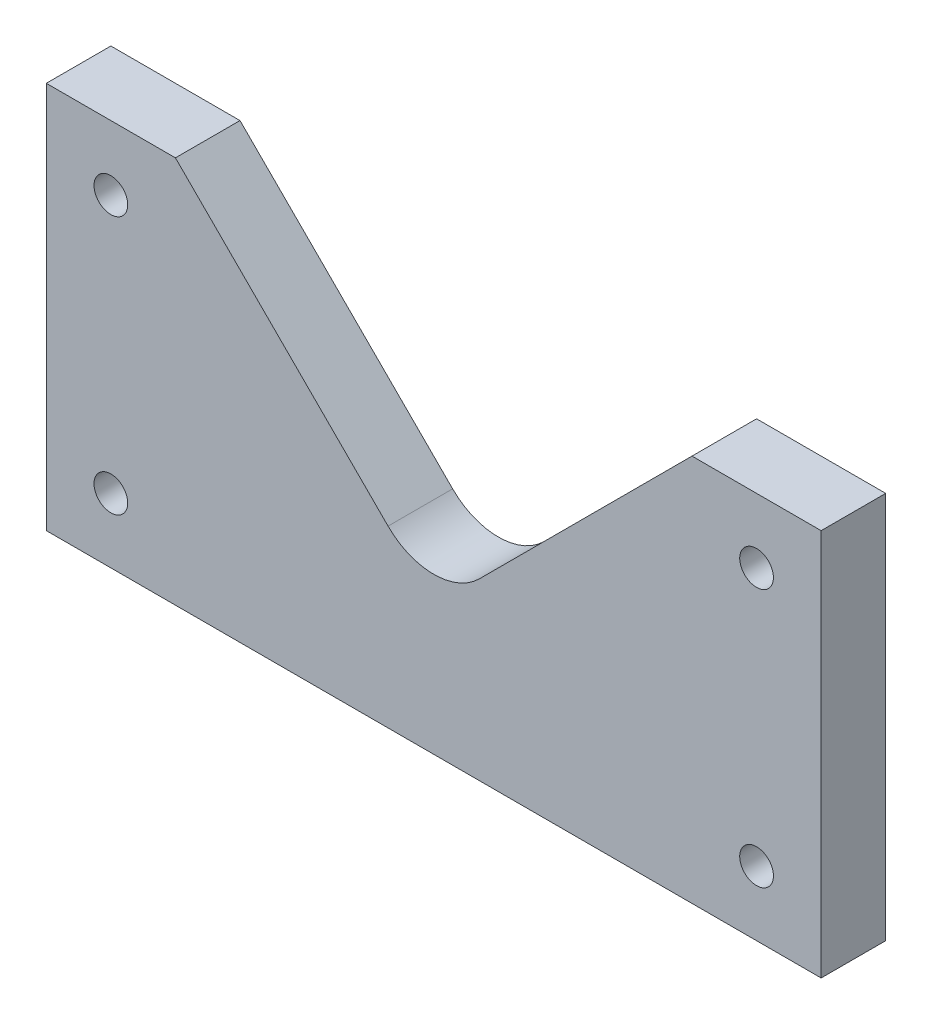
ISO-10303-21;
HEADER;
FILE_DESCRIPTION(('STEP AP214'),'2;1');
FILE_NAME('part.step','',(''),(''),'','','');
FILE_SCHEMA(('AUTOMOTIVE_DESIGN { 1 0 10303 214 1 1 1 1 }'));
ENDSEC;
DATA;
#1=APPLICATION_CONTEXT('core data for automotive mechanical design processes');
#2=APPLICATION_PROTOCOL_DEFINITION('international standard','automotive_design',2000,#1);
#3=PRODUCT_CONTEXT('',#1,'mechanical');
#4=PRODUCT('Part','Part','',(#3));
#5=PRODUCT_RELATED_PRODUCT_CATEGORY('part','',(#4));
#6=PRODUCT_DEFINITION_FORMATION('','',#4);
#7=PRODUCT_DEFINITION_CONTEXT('part definition',#1,'design');
#8=PRODUCT_DEFINITION('design','',#6,#7);
#9=PRODUCT_DEFINITION_SHAPE('','',#8);
#10=(LENGTH_UNIT() NAMED_UNIT(*) SI_UNIT(.MILLI.,.METRE.));
#11=(NAMED_UNIT(*) PLANE_ANGLE_UNIT() SI_UNIT($,.RADIAN.));
#12=(NAMED_UNIT(*) SI_UNIT($,.STERADIAN.) SOLID_ANGLE_UNIT());
#13=UNCERTAINTY_MEASURE_WITH_UNIT(LENGTH_MEASURE(1.E-05),#10,'distance_accuracy_value','');
#14=(GEOMETRIC_REPRESENTATION_CONTEXT(3) GLOBAL_UNCERTAINTY_ASSIGNED_CONTEXT((#13)) GLOBAL_UNIT_ASSIGNED_CONTEXT((#10,
#11,#12)) REPRESENTATION_CONTEXT('',''));
#15=CARTESIAN_POINT('',(0.,0.,0.));
#16=DIRECTION('',(0.,0.,1.));
#17=DIRECTION('',(1.,0.,0.));
#18=AXIS2_PLACEMENT_3D('',#15,#16,#17);
#19=CARTESIAN_POINT('',(0.,17.9605122421383,-6.35));
#20=DIRECTION('',(0.,0.,-1.));
#21=DIRECTION('',(-1.,0.,0.));
#22=AXIS2_PLACEMENT_3D('',#19,#20,#21);
#23=CYLINDRICAL_SURFACE('',#22,12.7);
#24=DIRECTION('',(0.,0.,1.));
#25=VECTOR('',#24,1.);
#26=CARTESIAN_POINT('',(8.98025612106917,8.9802561210692,-6.35));
#27=LINE('',#26,#25);
#28=CARTESIAN_POINT('',(8.98025612106917,8.9802561210692,-6.35));
#29=VERTEX_POINT('',#28);
#30=CARTESIAN_POINT('',(8.98025612106917,8.9802561210692,6.35));
#31=VERTEX_POINT('',#30);
#32=EDGE_CURVE('E137',#29,#31,#27,.T.);
#33=ORIENTED_EDGE('',*,*,#32,.F.);
#34=CARTESIAN_POINT('',(0.,17.9605122421383,-6.35));
#35=DIRECTION('',(0.,0.,1.));
#36=DIRECTION('',(1.,0.,0.));
#37=AXIS2_PLACEMENT_3D('',#34,#35,#36);
#38=CIRCLE('',#37,12.7);
#39=CARTESIAN_POINT('',(-8.98025612106917,8.9802561210692,-6.35));
#40=VERTEX_POINT('',#39);
#41=EDGE_CURVE('E40',#29,#40,#38,.F.);
#42=ORIENTED_EDGE('',*,*,#41,.T.);
#43=DIRECTION('',(0.,0.,1.));
#44=VECTOR('',#43,1.);
#45=CARTESIAN_POINT('',(-8.98025612106917,8.9802561210692,-6.35));
#46=LINE('',#45,#44);
#47=CARTESIAN_POINT('',(-8.98025612106917,8.9802561210692,6.35));
#48=VERTEX_POINT('',#47);
#49=EDGE_CURVE('E140',#48,#40,#46,.F.);
#50=ORIENTED_EDGE('',*,*,#49,.F.);
#51=CARTESIAN_POINT('',(0.,17.9605122421383,6.35));
#52=DIRECTION('',(0.,0.,1.));
#53=DIRECTION('',(1.,0.,0.));
#54=AXIS2_PLACEMENT_3D('',#51,#52,#53);
#55=CIRCLE('',#54,12.7);
#56=EDGE_CURVE('E11',#48,#31,#55,.T.);
#57=ORIENTED_EDGE('',*,*,#56,.T.);
#58=EDGE_LOOP('',(#33,#42,#50,#57));
#59=FACE_BOUND('',#58,.T.);
#60=ADVANCED_FACE('F33',(#59),#23,.F.);
#61=CARTESIAN_POINT('',(-76.2,50.8,6.35));
#62=DIRECTION('',(0.,-1.,0.));
#63=DIRECTION('',(0.,0.,-1.));
#64=AXIS2_PLACEMENT_3D('',#61,#62,#63);
#65=PLANE('',#64);
#66=DIRECTION('',(-1.,0.,0.));
#67=VECTOR('',#66,1.);
#68=CARTESIAN_POINT('',(-76.2,50.8,6.35));
#69=LINE('',#68,#67);
#70=CARTESIAN_POINT('',(-50.7999999999998,50.8,6.35));
#71=VERTEX_POINT('',#70);
#72=CARTESIAN_POINT('',(-76.2,50.8,6.35));
#73=VERTEX_POINT('',#72);
#74=EDGE_CURVE('E159',#71,#73,#69,.T.);
#75=ORIENTED_EDGE('',*,*,#74,.F.);
#76=DIRECTION('',(0.,0.,1.));
#77=VECTOR('',#76,1.);
#78=CARTESIAN_POINT('',(-50.7999999999998,50.8,-6.35));
#79=LINE('',#78,#77);
#80=CARTESIAN_POINT('',(-50.7999999999998,50.8,-6.35));
#81=VERTEX_POINT('',#80);
#82=EDGE_CURVE('E121',#81,#71,#79,.T.);
#83=ORIENTED_EDGE('',*,*,#82,.F.);
#84=DIRECTION('',(-1.,0.,0.));
#85=VECTOR('',#84,1.);
#86=CARTESIAN_POINT('',(-76.2,50.8,-6.35));
#87=LINE('',#86,#85);
#88=CARTESIAN_POINT('',(-76.2,50.8,-6.35));
#89=VERTEX_POINT('',#88);
#90=EDGE_CURVE('E120',#81,#89,#87,.T.);
#91=ORIENTED_EDGE('',*,*,#90,.T.);
#92=DIRECTION('',(0.,0.,-1.));
#93=VECTOR('',#92,1.);
#94=CARTESIAN_POINT('',(-76.2,50.8,6.35));
#95=LINE('',#94,#93);
#96=EDGE_CURVE('E132',#73,#89,#95,.T.);
#97=ORIENTED_EDGE('',*,*,#96,.F.);
#98=EDGE_LOOP('',(#75,#83,#91,#97));
#99=FACE_BOUND('',#98,.T.);
#100=ADVANCED_FACE('F169',(#99),#65,.F.);
#101=CARTESIAN_POINT('',(76.2,50.8,6.35));
#102=DIRECTION('',(-1.,0.,0.));
#103=DIRECTION('',(0.,-1.,0.));
#104=AXIS2_PLACEMENT_3D('',#101,#102,#103);
#105=PLANE('',#104);
#106=DIRECTION('',(0.,1.,0.));
#107=VECTOR('',#106,1.);
#108=CARTESIAN_POINT('',(76.2,50.8,6.35));
#109=LINE('',#108,#107);
#110=CARTESIAN_POINT('',(76.2,-25.4,6.35));
#111=VERTEX_POINT('',#110);
#112=CARTESIAN_POINT('',(76.2,50.8,6.35));
#113=VERTEX_POINT('',#112);
#114=EDGE_CURVE('E113',#111,#113,#109,.T.);
#115=ORIENTED_EDGE('',*,*,#114,.F.);
#116=DIRECTION('',(0.,0.,1.));
#117=VECTOR('',#116,1.);
#118=CARTESIAN_POINT('',(76.2,-25.4,-6.35));
#119=LINE('',#118,#117);
#120=CARTESIAN_POINT('',(76.2,-25.4,-6.35));
#121=VERTEX_POINT('',#120);
#122=EDGE_CURVE('E97',#121,#111,#119,.T.);
#123=ORIENTED_EDGE('',*,*,#122,.F.);
#124=DIRECTION('',(0.,1.,0.));
#125=VECTOR('',#124,1.);
#126=CARTESIAN_POINT('',(76.2,50.8,-6.35));
#127=LINE('',#126,#125);
#128=CARTESIAN_POINT('',(76.2,50.8,-6.35));
#129=VERTEX_POINT('',#128);
#130=EDGE_CURVE('E111',#121,#129,#127,.T.);
#131=ORIENTED_EDGE('',*,*,#130,.T.);
#132=DIRECTION('',(0.,0.,-1.));
#133=VECTOR('',#132,1.);
#134=CARTESIAN_POINT('',(76.2,50.8,6.35));
#135=LINE('',#134,#133);
#136=EDGE_CURVE('E135',#113,#129,#135,.T.);
#137=ORIENTED_EDGE('',*,*,#136,.F.);
#138=EDGE_LOOP('',(#115,#123,#131,#137));
#139=FACE_BOUND('',#138,.T.);
#140=ADVANCED_FACE('F109',(#139),#105,.F.);
#141=CARTESIAN_POINT('',(50.7999999999998,50.8,-6.35));
#142=VERTEX_POINT('',#141);
#143=EDGE_CURVE('E118',#129,#142,#87,.T.);
#144=ORIENTED_EDGE('',*,*,#143,.T.);
#145=DIRECTION('',(0.,0.,1.));
#146=VECTOR('',#145,1.);
#147=CARTESIAN_POINT('',(50.7999999999998,50.8,-6.35));
#148=LINE('',#147,#146);
#149=CARTESIAN_POINT('',(50.7999999999998,50.8,6.35));
#150=VERTEX_POINT('',#149);
#151=EDGE_CURVE('E124',#142,#150,#148,.T.);
#152=ORIENTED_EDGE('',*,*,#151,.T.);
#153=EDGE_CURVE('E160',#113,#150,#69,.T.);
#154=ORIENTED_EDGE('',*,*,#153,.F.);
#155=ORIENTED_EDGE('',*,*,#136,.T.);
#156=EDGE_LOOP('',(#144,#152,#154,#155));
#157=FACE_BOUND('',#156,.T.);
#158=ADVANCED_FACE('F231',(#157),#65,.F.);
#159=CARTESIAN_POINT('',(-76.2,50.8,6.35));
#160=DIRECTION('',(1.,0.,0.));
#161=DIRECTION('',(0.,1.,0.));
#162=AXIS2_PLACEMENT_3D('',#159,#160,#161);
#163=PLANE('',#162);
#164=DIRECTION('',(0.,-1.,0.));
#165=VECTOR('',#164,1.);
#166=CARTESIAN_POINT('',(-76.2,50.8,-6.35));
#167=LINE('',#166,#165);
#168=CARTESIAN_POINT('',(-76.2,-25.4,-6.35));
#169=VERTEX_POINT('',#168);
#170=EDGE_CURVE('E130',#89,#169,#167,.T.);
#171=ORIENTED_EDGE('',*,*,#170,.T.);
#172=DIRECTION('',(0.,0.,1.));
#173=VECTOR('',#172,1.);
#174=CARTESIAN_POINT('',(-76.2,-25.4,-6.35));
#175=LINE('',#174,#173);
#176=CARTESIAN_POINT('',(-76.2,-25.4,6.35));
#177=VERTEX_POINT('',#176);
#178=EDGE_CURVE('E100',#169,#177,#175,.T.);
#179=ORIENTED_EDGE('',*,*,#178,.T.);
#180=DIRECTION('',(0.,-1.,0.));
#181=VECTOR('',#180,1.);
#182=CARTESIAN_POINT('',(-76.2,50.8,6.35));
#183=LINE('',#182,#181);
#184=EDGE_CURVE('E127',#73,#177,#183,.T.);
#185=ORIENTED_EDGE('',*,*,#184,.F.);
#186=ORIENTED_EDGE('',*,*,#96,.T.);
#187=EDGE_LOOP('',(#171,#179,#185,#186));
#188=FACE_BOUND('',#187,.T.);
#189=ADVANCED_FACE('F171',(#188),#163,.F.);
#190=CARTESIAN_POINT('',(0.,0.,6.35));
#191=DIRECTION('',(0.,0.,1.));
#192=DIRECTION('',(1.,0.,0.));
#193=AXIS2_PLACEMENT_3D('',#190,#191,#192);
#194=PLANE('',#193);
#195=CARTESIAN_POINT('',(-63.5,38.1,6.35));
#196=DIRECTION('',(0.,0.,1.));
#197=DIRECTION('',(1.,0.,0.));
#198=AXIS2_PLACEMENT_3D('',#195,#196,#197);
#199=CIRCLE('',#198,3.3147);
#200=CARTESIAN_POINT('',(-60.1853,38.1,6.35));
#201=VERTEX_POINT('',#200);
#202=EDGE_CURVE('E195',#201,#201,#199,.T.);
#203=ORIENTED_EDGE('',*,*,#202,.F.);
#204=EDGE_LOOP('',(#203));
#205=FACE_BOUND('',#204,.T.);
#206=CARTESIAN_POINT('',(-63.5,-12.7,6.35));
#207=DIRECTION('',(0.,0.,1.));
#208=DIRECTION('',(1.,0.,0.));
#209=AXIS2_PLACEMENT_3D('',#206,#207,#208);
#210=CIRCLE('',#209,3.3147);
#211=CARTESIAN_POINT('',(-60.1853,-12.7,6.35));
#212=VERTEX_POINT('',#211);
#213=EDGE_CURVE('E189',#212,#212,#210,.T.);
#214=ORIENTED_EDGE('',*,*,#213,.F.);
#215=EDGE_LOOP('',(#214));
#216=FACE_BOUND('',#215,.T.);
#217=CARTESIAN_POINT('',(63.5,-12.7,6.35));
#218=DIRECTION('',(0.,0.,1.));
#219=DIRECTION('',(1.,0.,0.));
#220=AXIS2_PLACEMENT_3D('',#217,#218,#219);
#221=CIRCLE('',#220,3.3147);
#222=CARTESIAN_POINT('',(66.8147,-12.7,6.35));
#223=VERTEX_POINT('',#222);
#224=EDGE_CURVE('E183',#223,#223,#221,.T.);
#225=ORIENTED_EDGE('',*,*,#224,.F.);
#226=EDGE_LOOP('',(#225));
#227=FACE_BOUND('',#226,.T.);
#228=CARTESIAN_POINT('',(63.5,38.1,6.35));
#229=DIRECTION('',(0.,0.,1.));
#230=DIRECTION('',(1.,0.,0.));
#231=AXIS2_PLACEMENT_3D('',#228,#229,#230);
#232=CIRCLE('',#231,3.3147);
#233=CARTESIAN_POINT('',(66.8147,38.1,6.35));
#234=VERTEX_POINT('',#233);
#235=EDGE_CURVE('E177',#234,#234,#232,.T.);
#236=ORIENTED_EDGE('',*,*,#235,.F.);
#237=EDGE_LOOP('',(#236));
#238=FACE_BOUND('',#237,.T.);
#239=DIRECTION('',(-1.,0.,0.));
#240=VECTOR('',#239,1.);
#241=CARTESIAN_POINT('',(-76.2,-25.4,6.35));
#242=LINE('',#241,#240);
#243=EDGE_CURVE('E105',#111,#177,#242,.T.);
#244=ORIENTED_EDGE('',*,*,#243,.F.);
#245=ORIENTED_EDGE('',*,*,#114,.T.);
#246=ORIENTED_EDGE('',*,*,#153,.T.);
#247=DIRECTION('',(0.707106781186546,0.707106781186549,0.));
#248=VECTOR('',#247,1.);
#249=CARTESIAN_POINT('',(0.,0.,6.35));
#250=LINE('',#249,#248);
#251=EDGE_CURVE('E150',#31,#150,#250,.T.);
#252=ORIENTED_EDGE('',*,*,#251,.F.);
#253=ORIENTED_EDGE('',*,*,#56,.F.);
#254=DIRECTION('',(0.707106781186546,-0.707106781186549,0.));
#255=VECTOR('',#254,1.);
#256=CARTESIAN_POINT('',(-50.7999999999998,50.8,6.35));
#257=LINE('',#256,#255);
#258=EDGE_CURVE('E147',#71,#48,#257,.T.);
#259=ORIENTED_EDGE('',*,*,#258,.F.);
#260=ORIENTED_EDGE('',*,*,#74,.T.);
#261=ORIENTED_EDGE('',*,*,#184,.T.);
#262=EDGE_LOOP('',(#244,#245,#246,#252,#253,#259,#260,#261));
#263=FACE_BOUND('',#262,.T.);
#264=ADVANCED_FACE('F166',(#205,#216,#227,#238,#263),#194,.T.);
#265=CARTESIAN_POINT('',(0.,0.,-6.35));
#266=DIRECTION('',(0.,0.,1.));
#267=DIRECTION('',(1.,0.,0.));
#268=AXIS2_PLACEMENT_3D('',#265,#266,#267);
#269=PLANE('',#268);
#270=ORIENTED_EDGE('',*,*,#41,.F.);
#271=DIRECTION('',(0.707106781186546,0.707106781186549,0.));
#272=VECTOR('',#271,1.);
#273=CARTESIAN_POINT('',(0.,0.,-6.35));
#274=LINE('',#273,#272);
#275=EDGE_CURVE('E149',#29,#142,#274,.T.);
#276=ORIENTED_EDGE('',*,*,#275,.T.);
#277=ORIENTED_EDGE('',*,*,#143,.F.);
#278=ORIENTED_EDGE('',*,*,#130,.F.);
#279=DIRECTION('',(-1.,0.,0.));
#280=VECTOR('',#279,1.);
#281=CARTESIAN_POINT('',(-76.2,-25.4,-6.35));
#282=LINE('',#281,#280);
#283=EDGE_CURVE('E94',#121,#169,#282,.T.);
#284=ORIENTED_EDGE('',*,*,#283,.T.);
#285=ORIENTED_EDGE('',*,*,#170,.F.);
#286=ORIENTED_EDGE('',*,*,#90,.F.);
#287=DIRECTION('',(0.707106781186546,-0.707106781186549,0.));
#288=VECTOR('',#287,1.);
#289=CARTESIAN_POINT('',(-50.7999999999998,50.8,-6.35));
#290=LINE('',#289,#288);
#291=EDGE_CURVE('E145',#81,#40,#290,.T.);
#292=ORIENTED_EDGE('',*,*,#291,.T.);
#293=EDGE_LOOP('',(#270,#276,#277,#278,#284,#285,#286,#292));
#294=FACE_BOUND('',#293,.T.);
#295=CARTESIAN_POINT('',(-63.5,38.1,-6.35));
#296=DIRECTION('',(0.,0.,1.));
#297=DIRECTION('',(1.,0.,0.));
#298=AXIS2_PLACEMENT_3D('',#295,#296,#297);
#299=CIRCLE('',#298,3.3147);
#300=CARTESIAN_POINT('',(-60.1853,38.1,-6.35));
#301=VERTEX_POINT('',#300);
#302=EDGE_CURVE('E192',#301,#301,#299,.T.);
#303=ORIENTED_EDGE('',*,*,#302,.T.);
#304=EDGE_LOOP('',(#303));
#305=FACE_BOUND('',#304,.T.);
#306=CARTESIAN_POINT('',(-63.5,-12.7,-6.35));
#307=DIRECTION('',(0.,0.,1.));
#308=DIRECTION('',(1.,0.,0.));
#309=AXIS2_PLACEMENT_3D('',#306,#307,#308);
#310=CIRCLE('',#309,3.3147);
#311=CARTESIAN_POINT('',(-60.1853,-12.7,-6.35));
#312=VERTEX_POINT('',#311);
#313=EDGE_CURVE('E186',#312,#312,#310,.T.);
#314=ORIENTED_EDGE('',*,*,#313,.T.);
#315=EDGE_LOOP('',(#314));
#316=FACE_BOUND('',#315,.T.);
#317=CARTESIAN_POINT('',(63.5,-12.7,-6.35));
#318=DIRECTION('',(0.,0.,1.));
#319=DIRECTION('',(1.,0.,0.));
#320=AXIS2_PLACEMENT_3D('',#317,#318,#319);
#321=CIRCLE('',#320,3.3147);
#322=CARTESIAN_POINT('',(66.8147,-12.7,-6.35));
#323=VERTEX_POINT('',#322);
#324=EDGE_CURVE('E180',#323,#323,#321,.T.);
#325=ORIENTED_EDGE('',*,*,#324,.T.);
#326=EDGE_LOOP('',(#325));
#327=FACE_BOUND('',#326,.T.);
#328=CARTESIAN_POINT('',(63.5,38.1,-6.35));
#329=DIRECTION('',(0.,0.,1.));
#330=DIRECTION('',(1.,0.,0.));
#331=AXIS2_PLACEMENT_3D('',#328,#329,#330);
#332=CIRCLE('',#331,3.3147);
#333=CARTESIAN_POINT('',(66.8147,38.1,-6.35));
#334=VERTEX_POINT('',#333);
#335=EDGE_CURVE('E173',#334,#334,#332,.T.);
#336=ORIENTED_EDGE('',*,*,#335,.T.);
#337=EDGE_LOOP('',(#336));
#338=FACE_BOUND('',#337,.T.);
#339=ADVANCED_FACE('F115',(#294,#305,#316,#327,#338),#269,.F.);
#340=CARTESIAN_POINT('',(-50.7999999999998,50.8,-6.35));
#341=DIRECTION('',(-0.707106781186549,-0.707106781186546,0.));
#342=DIRECTION('',(0.707106781186546,-0.707106781186549,0.));
#343=AXIS2_PLACEMENT_3D('',#340,#341,#342);
#344=PLANE('',#343);
#345=ORIENTED_EDGE('',*,*,#258,.T.);
#346=ORIENTED_EDGE('',*,*,#49,.T.);
#347=ORIENTED_EDGE('',*,*,#291,.F.);
#348=ORIENTED_EDGE('',*,*,#82,.T.);
#349=EDGE_LOOP('',(#345,#346,#347,#348));
#350=FACE_BOUND('',#349,.T.);
#351=ADVANCED_FACE('F144',(#350),#344,.F.);
#352=CARTESIAN_POINT('',(0.,0.,-6.35));
#353=DIRECTION('',(0.707106781186549,-0.707106781186546,0.));
#354=DIRECTION('',(0.707106781186546,0.707106781186549,0.));
#355=AXIS2_PLACEMENT_3D('',#352,#353,#354);
#356=PLANE('',#355);
#357=ORIENTED_EDGE('',*,*,#275,.F.);
#358=ORIENTED_EDGE('',*,*,#32,.T.);
#359=ORIENTED_EDGE('',*,*,#251,.T.);
#360=ORIENTED_EDGE('',*,*,#151,.F.);
#361=EDGE_LOOP('',(#357,#358,#359,#360));
#362=FACE_BOUND('',#361,.T.);
#363=ADVANCED_FACE('F222',(#362),#356,.F.);
#364=CARTESIAN_POINT('',(-76.2,-25.4,-6.35));
#365=DIRECTION('',(0.,1.,0.));
#366=DIRECTION('',(0.,0.,1.));
#367=AXIS2_PLACEMENT_3D('',#364,#365,#366);
#368=PLANE('',#367);
#369=ORIENTED_EDGE('',*,*,#243,.T.);
#370=ORIENTED_EDGE('',*,*,#178,.F.);
#371=ORIENTED_EDGE('',*,*,#283,.F.);
#372=ORIENTED_EDGE('',*,*,#122,.T.);
#373=EDGE_LOOP('',(#369,#370,#371,#372));
#374=FACE_BOUND('',#373,.T.);
#375=ADVANCED_FACE('F96',(#374),#368,.F.);
#376=CARTESIAN_POINT('',(63.5,38.1,6.35));
#377=DIRECTION('',(0.,0.,1.));
#378=DIRECTION('',(1.,0.,0.));
#379=AXIS2_PLACEMENT_3D('',#376,#377,#378);
#380=CYLINDRICAL_SURFACE('',#379,3.3147);
#381=ORIENTED_EDGE('',*,*,#335,.F.);
#382=EDGE_LOOP('',(#381));
#383=FACE_BOUND('',#382,.T.);
#384=ORIENTED_EDGE('',*,*,#235,.T.);
#385=EDGE_LOOP('',(#384));
#386=FACE_BOUND('',#385,.T.);
#387=ADVANCED_FACE('F210',(#383,#386),#380,.F.);
#388=CARTESIAN_POINT('',(63.5,-12.7,6.35));
#389=DIRECTION('',(0.,0.,1.));
#390=DIRECTION('',(1.,0.,0.));
#391=AXIS2_PLACEMENT_3D('',#388,#389,#390);
#392=CYLINDRICAL_SURFACE('',#391,3.3147);
#393=ORIENTED_EDGE('',*,*,#324,.F.);
#394=EDGE_LOOP('',(#393));
#395=FACE_BOUND('',#394,.T.);
#396=ORIENTED_EDGE('',*,*,#224,.T.);
#397=EDGE_LOOP('',(#396));
#398=FACE_BOUND('',#397,.T.);
#399=ADVANCED_FACE('F212',(#395,#398),#392,.F.);
#400=CARTESIAN_POINT('',(-63.5,-12.7,6.35));
#401=DIRECTION('',(0.,0.,1.));
#402=DIRECTION('',(1.,0.,0.));
#403=AXIS2_PLACEMENT_3D('',#400,#401,#402);
#404=CYLINDRICAL_SURFACE('',#403,3.3147);
#405=ORIENTED_EDGE('',*,*,#313,.F.);
#406=EDGE_LOOP('',(#405));
#407=FACE_BOUND('',#406,.T.);
#408=ORIENTED_EDGE('',*,*,#213,.T.);
#409=EDGE_LOOP('',(#408));
#410=FACE_BOUND('',#409,.T.);
#411=ADVANCED_FACE('F219',(#407,#410),#404,.F.);
#412=CARTESIAN_POINT('',(-63.5,38.1,6.35));
#413=DIRECTION('',(0.,0.,1.));
#414=DIRECTION('',(1.,0.,0.));
#415=AXIS2_PLACEMENT_3D('',#412,#413,#414);
#416=CYLINDRICAL_SURFACE('',#415,3.3147);
#417=ORIENTED_EDGE('',*,*,#302,.F.);
#418=EDGE_LOOP('',(#417));
#419=FACE_BOUND('',#418,.T.);
#420=ORIENTED_EDGE('',*,*,#202,.T.);
#421=EDGE_LOOP('',(#420));
#422=FACE_BOUND('',#421,.T.);
#423=ADVANCED_FACE('F199',(#419,#422),#416,.F.);
#424=CLOSED_SHELL('',(#60,#100,#140,#158,#189,#264,#339,#351,#363,#375,#387,#399,#411,#423));
#425=MANIFOLD_SOLID_BREP('B2',#424);
#426=ADVANCED_BREP_SHAPE_REPRESENTATION('',(#18,#425),#14);
#427=SHAPE_DEFINITION_REPRESENTATION(#9,#426);
ENDSEC;
END-ISO-10303-21;
